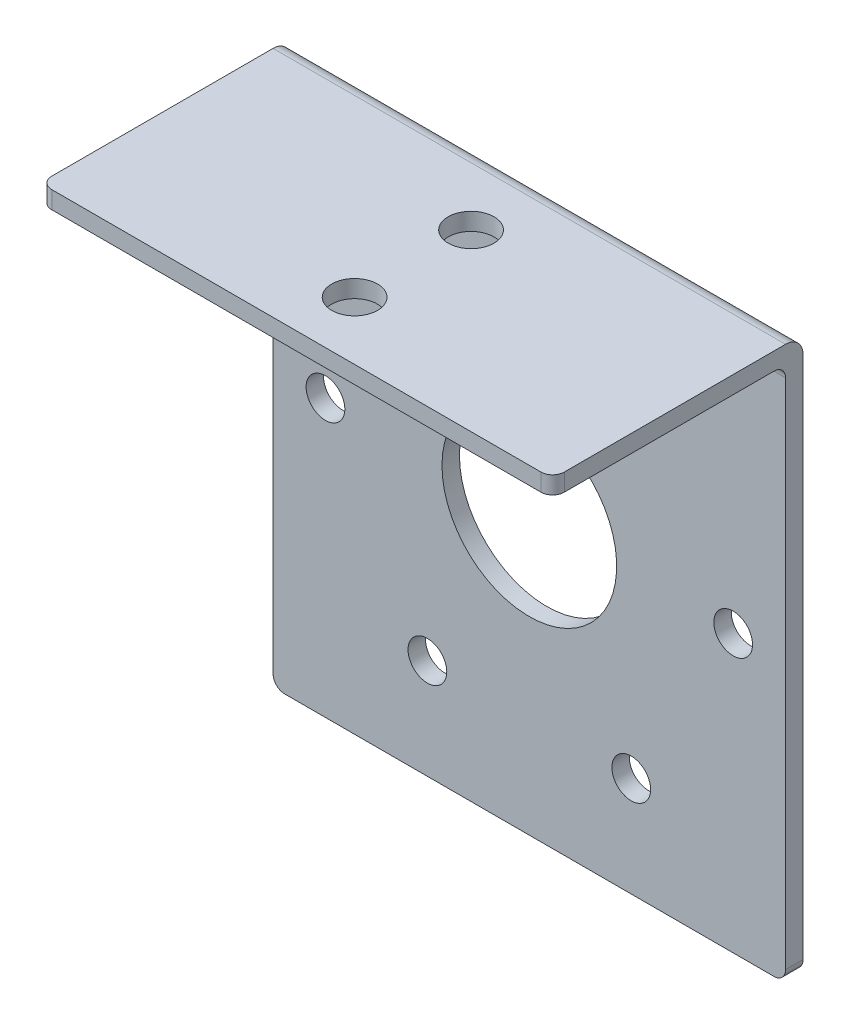
ISO-10303-21;
HEADER;
FILE_DESCRIPTION(('STEP AP214'),'2;1');
FILE_NAME('part.step','',(''),(''),'','','');
FILE_SCHEMA(('AUTOMOTIVE_DESIGN { 1 0 10303 214 1 1 1 1 }'));
ENDSEC;
DATA;
#1=APPLICATION_CONTEXT('core data for automotive mechanical design processes');
#2=APPLICATION_PROTOCOL_DEFINITION('international standard','automotive_design',2000,#1);
#3=PRODUCT_CONTEXT('',#1,'mechanical');
#4=PRODUCT('Part','Part','',(#3));
#5=PRODUCT_RELATED_PRODUCT_CATEGORY('part','',(#4));
#6=PRODUCT_DEFINITION_FORMATION('','',#4);
#7=PRODUCT_DEFINITION_CONTEXT('part definition',#1,'design');
#8=PRODUCT_DEFINITION('design','',#6,#7);
#9=PRODUCT_DEFINITION_SHAPE('','',#8);
#10=(LENGTH_UNIT() NAMED_UNIT(*) SI_UNIT(.MILLI.,.METRE.));
#11=(NAMED_UNIT(*) PLANE_ANGLE_UNIT() SI_UNIT($,.RADIAN.));
#12=(NAMED_UNIT(*) SI_UNIT($,.STERADIAN.) SOLID_ANGLE_UNIT());
#13=UNCERTAINTY_MEASURE_WITH_UNIT(LENGTH_MEASURE(1.E-05),#10,'distance_accuracy_value','');
#14=(GEOMETRIC_REPRESENTATION_CONTEXT(3) GLOBAL_UNCERTAINTY_ASSIGNED_CONTEXT((#13)) GLOBAL_UNIT_ASSIGNED_CONTEXT((#10,
#11,#12)) REPRESENTATION_CONTEXT('',''));
#15=CARTESIAN_POINT('',(0.,0.,0.));
#16=DIRECTION('',(0.,0.,1.));
#17=DIRECTION('',(1.,0.,0.));
#18=AXIS2_PLACEMENT_3D('',#15,#16,#17);
#19=CARTESIAN_POINT('',(44.,-47.5,3.));
#20=DIRECTION('',(-1.,0.,0.));
#21=DIRECTION('',(0.,0.,1.));
#22=AXIS2_PLACEMENT_3D('',#19,#20,#21);
#23=PLANE('',#22);
#24=DIRECTION('',(0.,1.,0.));
#25=VECTOR('',#24,1.);
#26=CARTESIAN_POINT('',(44.,-47.5,3.));
#27=LINE('',#26,#25);
#28=CARTESIAN_POINT('',(44.,-45.5,3.));
#29=VERTEX_POINT('',#28);
#30=CARTESIAN_POINT('',(44.,42.5,3.));
#31=VERTEX_POINT('',#30);
#32=EDGE_CURVE('E247',#29,#31,#27,.T.);
#33=ORIENTED_EDGE('',*,*,#32,.F.);
#34=DIRECTION('',(0.,0.,-1.));
#35=VECTOR('',#34,1.);
#36=CARTESIAN_POINT('',(44.,-45.5,3.));
#37=LINE('',#36,#35);
#38=CARTESIAN_POINT('',(44.,-45.5,0.));
#39=VERTEX_POINT('',#38);
#40=EDGE_CURVE('E171',#29,#39,#37,.T.);
#41=ORIENTED_EDGE('',*,*,#40,.T.);
#42=DIRECTION('',(0.,1.,0.));
#43=VECTOR('',#42,1.);
#44=CARTESIAN_POINT('',(44.,-47.5,0.));
#45=LINE('',#44,#43);
#46=CARTESIAN_POINT('',(44.,44.5,0.));
#47=VERTEX_POINT('',#46);
#48=EDGE_CURVE('E136',#39,#47,#45,.T.);
#49=ORIENTED_EDGE('',*,*,#48,.T.);
#50=CARTESIAN_POINT('',(44.,44.5,3.));
#51=DIRECTION('',(-1.,0.,0.));
#52=DIRECTION('',(0.,0.,1.));
#53=AXIS2_PLACEMENT_3D('',#50,#51,#52);
#54=CIRCLE('',#53,3.);
#55=CARTESIAN_POINT('',(44.,47.5,3.));
#56=VERTEX_POINT('',#55);
#57=EDGE_CURVE('E132',#47,#56,#54,.F.);
#58=ORIENTED_EDGE('',*,*,#57,.T.);
#59=DIRECTION('',(0.,0.,-1.));
#60=VECTOR('',#59,1.);
#61=CARTESIAN_POINT('',(44.,47.5,3.));
#62=LINE('',#61,#60);
#63=CARTESIAN_POINT('',(44.,47.5,41.));
#64=VERTEX_POINT('',#63);
#65=EDGE_CURVE('E123',#64,#56,#62,.T.);
#66=ORIENTED_EDGE('',*,*,#65,.F.);
#67=DIRECTION('',(0.,1.,0.));
#68=VECTOR('',#67,1.);
#69=CARTESIAN_POINT('',(44.,44.5,41.));
#70=LINE('',#69,#68);
#71=CARTESIAN_POINT('',(44.,44.5,41.));
#72=VERTEX_POINT('',#71);
#73=EDGE_CURVE('E160',#64,#72,#70,.F.);
#74=ORIENTED_EDGE('',*,*,#73,.T.);
#75=DIRECTION('',(0.,0.,1.));
#76=VECTOR('',#75,1.);
#77=CARTESIAN_POINT('',(44.,44.5,2.));
#78=LINE('',#77,#76);
#79=CARTESIAN_POINT('',(44.,44.5,5.));
#80=VERTEX_POINT('',#79);
#81=EDGE_CURVE('E242',#80,#72,#78,.T.);
#82=ORIENTED_EDGE('',*,*,#81,.F.);
#83=CARTESIAN_POINT('',(44.,42.5,5.));
#84=DIRECTION('',(-1.,0.,0.));
#85=DIRECTION('',(0.,0.,1.));
#86=AXIS2_PLACEMENT_3D('',#83,#84,#85);
#87=CIRCLE('',#86,2.);
#88=EDGE_CURVE('E157',#80,#31,#87,.T.);
#89=ORIENTED_EDGE('',*,*,#88,.T.);
#90=EDGE_LOOP('',(#33,#41,#49,#58,#66,#74,#82,#89));
#91=FACE_BOUND('',#90,.T.);
#92=ADVANCED_FACE('F33',(#91),#23,.F.);
#93=CARTESIAN_POINT('',(-44.,47.5,3.));
#94=DIRECTION('',(0.,-1.,0.));
#95=DIRECTION('',(0.,0.,-1.));
#96=AXIS2_PLACEMENT_3D('',#93,#94,#95);
#97=PLANE('',#96);
#98=CARTESIAN_POINT('',(0.,47.5,33.));
#99=DIRECTION('',(0.,1.,0.));
#100=DIRECTION('',(0.,0.,1.));
#101=AXIS2_PLACEMENT_3D('',#98,#99,#100);
#102=CIRCLE('',#101,3.935);
#103=CARTESIAN_POINT('',(0.,47.5,36.935));
#104=VERTEX_POINT('',#103);
#105=EDGE_CURVE('E169',#104,#104,#102,.T.);
#106=ORIENTED_EDGE('',*,*,#105,.F.);
#107=EDGE_LOOP('',(#106));
#108=FACE_BOUND('',#107,.T.);
#109=CARTESIAN_POINT('',(0.,47.5,13.));
#110=DIRECTION('',(0.,1.,0.));
#111=DIRECTION('',(0.,0.,1.));
#112=AXIS2_PLACEMENT_3D('',#109,#110,#111);
#113=CIRCLE('',#112,3.935);
#114=CARTESIAN_POINT('',(0.,47.5,16.935));
#115=VERTEX_POINT('',#114);
#116=EDGE_CURVE('E165',#115,#115,#113,.T.);
#117=ORIENTED_EDGE('',*,*,#116,.F.);
#118=EDGE_LOOP('',(#117));
#119=FACE_BOUND('',#118,.T.);
#120=DIRECTION('',(0.,0.,-1.));
#121=VECTOR('',#120,1.);
#122=CARTESIAN_POINT('',(-44.,47.5,3.));
#123=LINE('',#122,#121);
#124=CARTESIAN_POINT('',(-44.,47.5,41.));
#125=VERTEX_POINT('',#124);
#126=CARTESIAN_POINT('',(-44.,47.5,3.));
#127=VERTEX_POINT('',#126);
#128=EDGE_CURVE('E129',#125,#127,#123,.T.);
#129=ORIENTED_EDGE('',*,*,#128,.F.);
#130=CARTESIAN_POINT('',(-42.,47.5,41.));
#131=DIRECTION('',(0.,-1.,0.));
#132=DIRECTION('',(0.,0.,-1.));
#133=AXIS2_PLACEMENT_3D('',#130,#131,#132);
#134=CIRCLE('',#133,2.);
#135=CARTESIAN_POINT('',(-42.,47.5,43.));
#136=VERTEX_POINT('',#135);
#137=EDGE_CURVE('E11',#125,#136,#134,.F.);
#138=ORIENTED_EDGE('',*,*,#137,.T.);
#139=DIRECTION('',(-1.,0.,0.));
#140=VECTOR('',#139,1.);
#141=CARTESIAN_POINT('',(-44.,47.5,43.));
#142=LINE('',#141,#140);
#143=CARTESIAN_POINT('',(42.,47.5,43.));
#144=VERTEX_POINT('',#143);
#145=EDGE_CURVE('E239',#144,#136,#142,.T.);
#146=ORIENTED_EDGE('',*,*,#145,.F.);
#147=CARTESIAN_POINT('',(42.,47.5,41.));
#148=DIRECTION('',(0.,-1.,0.));
#149=DIRECTION('',(0.,0.,-1.));
#150=AXIS2_PLACEMENT_3D('',#147,#148,#149);
#151=CIRCLE('',#150,2.);
#152=EDGE_CURVE('E42',#144,#64,#151,.F.);
#153=ORIENTED_EDGE('',*,*,#152,.T.);
#154=ORIENTED_EDGE('',*,*,#65,.T.);
#155=DIRECTION('',(-1.,0.,0.));
#156=VECTOR('',#155,1.);
#157=CARTESIAN_POINT('',(-44.,47.5,3.));
#158=LINE('',#157,#156);
#159=EDGE_CURVE('E127',#56,#127,#158,.T.);
#160=ORIENTED_EDGE('',*,*,#159,.T.);
#161=EDGE_LOOP('',(#129,#138,#146,#153,#154,#160));
#162=FACE_BOUND('',#161,.T.);
#163=ADVANCED_FACE('F125',(#108,#119,#162),#97,.F.);
#164=CARTESIAN_POINT('',(-44.,-47.5,3.));
#165=DIRECTION('',(1.,0.,0.));
#166=DIRECTION('',(0.,0.,-1.));
#167=AXIS2_PLACEMENT_3D('',#164,#165,#166);
#168=PLANE('',#167);
#169=DIRECTION('',(0.,-1.,0.));
#170=VECTOR('',#169,1.);
#171=CARTESIAN_POINT('',(-44.,-47.5,0.));
#172=LINE('',#171,#170);
#173=CARTESIAN_POINT('',(-44.,44.5,0.));
#174=VERTEX_POINT('',#173);
#175=CARTESIAN_POINT('',(-44.,-45.5,0.));
#176=VERTEX_POINT('',#175);
#177=EDGE_CURVE('E257',#174,#176,#172,.T.);
#178=ORIENTED_EDGE('',*,*,#177,.T.);
#179=DIRECTION('',(0.,0.,-1.));
#180=VECTOR('',#179,1.);
#181=CARTESIAN_POINT('',(-44.,-45.5,3.));
#182=LINE('',#181,#180);
#183=CARTESIAN_POINT('',(-44.,-45.5,3.));
#184=VERTEX_POINT('',#183);
#185=EDGE_CURVE('E188',#176,#184,#182,.F.);
#186=ORIENTED_EDGE('',*,*,#185,.T.);
#187=DIRECTION('',(0.,-1.,0.));
#188=VECTOR('',#187,1.);
#189=CARTESIAN_POINT('',(-44.,-47.5,3.));
#190=LINE('',#189,#188);
#191=CARTESIAN_POINT('',(-44.,42.5,3.));
#192=VERTEX_POINT('',#191);
#193=EDGE_CURVE('E249',#192,#184,#190,.T.);
#194=ORIENTED_EDGE('',*,*,#193,.F.);
#195=CARTESIAN_POINT('',(-44.,42.5,5.));
#196=DIRECTION('',(1.,0.,0.));
#197=DIRECTION('',(0.,0.,-1.));
#198=AXIS2_PLACEMENT_3D('',#195,#196,#197);
#199=CIRCLE('',#198,2.);
#200=CARTESIAN_POINT('',(-44.,44.5,5.));
#201=VERTEX_POINT('',#200);
#202=EDGE_CURVE('E155',#192,#201,#199,.T.);
#203=ORIENTED_EDGE('',*,*,#202,.T.);
#204=DIRECTION('',(0.,0.,1.));
#205=VECTOR('',#204,1.);
#206=CARTESIAN_POINT('',(-44.,44.5,2.));
#207=LINE('',#206,#205);
#208=CARTESIAN_POINT('',(-44.,44.5,41.));
#209=VERTEX_POINT('',#208);
#210=EDGE_CURVE('E241',#201,#209,#207,.T.);
#211=ORIENTED_EDGE('',*,*,#210,.T.);
#212=DIRECTION('',(0.,-1.,0.));
#213=VECTOR('',#212,1.);
#214=CARTESIAN_POINT('',(-44.,47.5,41.));
#215=LINE('',#214,#213);
#216=EDGE_CURVE('E186',#209,#125,#215,.F.);
#217=ORIENTED_EDGE('',*,*,#216,.T.);
#218=ORIENTED_EDGE('',*,*,#128,.T.);
#219=CARTESIAN_POINT('',(-44.,44.5,3.));
#220=DIRECTION('',(1.,0.,0.));
#221=DIRECTION('',(0.,0.,-1.));
#222=AXIS2_PLACEMENT_3D('',#219,#220,#221);
#223=CIRCLE('',#222,3.);
#224=EDGE_CURVE('E145',#127,#174,#223,.F.);
#225=ORIENTED_EDGE('',*,*,#224,.T.);
#226=EDGE_LOOP('',(#178,#186,#194,#203,#211,#217,#218,#225));
#227=FACE_BOUND('',#226,.T.);
#228=ADVANCED_FACE('F262',(#227),#168,.F.);
#229=CARTESIAN_POINT('',(-44.,-47.5,3.));
#230=DIRECTION('',(0.,1.,0.));
#231=DIRECTION('',(0.,0.,1.));
#232=AXIS2_PLACEMENT_3D('',#229,#230,#231);
#233=PLANE('',#232);
#234=DIRECTION('',(1.,0.,0.));
#235=VECTOR('',#234,1.);
#236=CARTESIAN_POINT('',(-44.,-47.5,0.));
#237=LINE('',#236,#235);
#238=CARTESIAN_POINT('',(-42.,-47.5,0.));
#239=VERTEX_POINT('',#238);
#240=CARTESIAN_POINT('',(42.,-47.5,0.));
#241=VERTEX_POINT('',#240);
#242=EDGE_CURVE('E250',#239,#241,#237,.T.);
#243=ORIENTED_EDGE('',*,*,#242,.T.);
#244=DIRECTION('',(0.,0.,-1.));
#245=VECTOR('',#244,1.);
#246=CARTESIAN_POINT('',(42.,-47.5,3.));
#247=LINE('',#246,#245);
#248=CARTESIAN_POINT('',(42.,-47.5,3.));
#249=VERTEX_POINT('',#248);
#250=EDGE_CURVE('E180',#241,#249,#247,.F.);
#251=ORIENTED_EDGE('',*,*,#250,.T.);
#252=DIRECTION('',(1.,0.,0.));
#253=VECTOR('',#252,1.);
#254=CARTESIAN_POINT('',(-44.,-47.5,3.));
#255=LINE('',#254,#253);
#256=CARTESIAN_POINT('',(-42.,-47.5,3.));
#257=VERTEX_POINT('',#256);
#258=EDGE_CURVE('E253',#257,#249,#255,.T.);
#259=ORIENTED_EDGE('',*,*,#258,.F.);
#260=DIRECTION('',(0.,0.,-1.));
#261=VECTOR('',#260,1.);
#262=CARTESIAN_POINT('',(-42.,-47.5,3.));
#263=LINE('',#262,#261);
#264=EDGE_CURVE('E177',#257,#239,#263,.T.);
#265=ORIENTED_EDGE('',*,*,#264,.T.);
#266=EDGE_LOOP('',(#243,#251,#259,#265));
#267=FACE_BOUND('',#266,.T.);
#268=ADVANCED_FACE('F292',(#267),#233,.F.);
#269=CARTESIAN_POINT('',(0.,0.,3.));
#270=DIRECTION('',(0.,0.,-1.));
#271=DIRECTION('',(-1.,0.,0.));
#272=AXIS2_PLACEMENT_3D('',#269,#270,#271);
#273=PLANE('',#272);
#274=CARTESIAN_POINT('',(17.5000000000004,30.3108891324552,3.));
#275=DIRECTION('',(0.,0.,1.));
#276=DIRECTION('',(0.50000000000001,0.866025403784433,0.));
#277=AXIS2_PLACEMENT_3D('',#274,#275,#276);
#278=CIRCLE('',#277,3.325);
#279=CARTESIAN_POINT('',(19.1625000000004,33.1904236000384,3.));
#280=VERTEX_POINT('',#279);
#281=EDGE_CURVE('E467',#280,#280,#278,.T.);
#282=ORIENTED_EDGE('',*,*,#281,.F.);
#283=EDGE_LOOP('',(#282));
#284=FACE_BOUND('',#283,.T.);
#285=CARTESIAN_POINT('',(-17.4999999999997,30.3108891324555,3.));
#286=DIRECTION('',(0.,0.,1.));
#287=DIRECTION('',(-0.499999999999992,0.866025403784443,0.));
#288=AXIS2_PLACEMENT_3D('',#285,#286,#287);
#289=CIRCLE('',#288,3.325);
#290=CARTESIAN_POINT('',(-19.1624999999997,33.1904236000388,3.));
#291=VERTEX_POINT('',#290);
#292=EDGE_CURVE('E468',#291,#291,#289,.T.);
#293=ORIENTED_EDGE('',*,*,#292,.F.);
#294=EDGE_LOOP('',(#293));
#295=FACE_BOUND('',#294,.T.);
#296=CARTESIAN_POINT('',(-35.,0.,3.));
#297=DIRECTION('',(0.,0.,1.));
#298=DIRECTION('',(-1.,0.,0.));
#299=AXIS2_PLACEMENT_3D('',#296,#297,#298);
#300=CIRCLE('',#299,3.325);
#301=CARTESIAN_POINT('',(-38.325,0.,3.));
#302=VERTEX_POINT('',#301);
#303=EDGE_CURVE('E470',#302,#302,#300,.T.);
#304=ORIENTED_EDGE('',*,*,#303,.F.);
#305=EDGE_LOOP('',(#304));
#306=FACE_BOUND('',#305,.T.);
#307=CARTESIAN_POINT('',(-17.5000000000001,-30.3108891324553,3.));
#308=DIRECTION('',(0.,0.,1.));
#309=DIRECTION('',(-0.500000000000004,-0.866025403784436,0.));
#310=AXIS2_PLACEMENT_3D('',#307,#308,#309);
#311=CIRCLE('',#310,3.325);
#312=CARTESIAN_POINT('',(-19.1625000000002,-33.1904236000385,3.));
#313=VERTEX_POINT('',#312);
#314=EDGE_CURVE('E475',#313,#313,#311,.T.);
#315=ORIENTED_EDGE('',*,*,#314,.F.);
#316=EDGE_LOOP('',(#315));
#317=FACE_BOUND('',#316,.T.);
#318=CARTESIAN_POINT('',(17.4999999999999,-30.3108891324554,3.));
#319=DIRECTION('',(0.,0.,1.));
#320=DIRECTION('',(0.499999999999998,-0.86602540378444,0.));
#321=AXIS2_PLACEMENT_3D('',#318,#319,#320);
#322=CIRCLE('',#321,3.325);
#323=CARTESIAN_POINT('',(19.1624999999999,-33.1904236000387,3.));
#324=VERTEX_POINT('',#323);
#325=EDGE_CURVE('E208',#324,#324,#322,.T.);
#326=ORIENTED_EDGE('',*,*,#325,.F.);
#327=EDGE_LOOP('',(#326));
#328=FACE_BOUND('',#327,.T.);
#329=CARTESIAN_POINT('',(35.,0.,3.));
#330=DIRECTION('',(0.,0.,1.));
#331=DIRECTION('',(1.,0.,0.));
#332=AXIS2_PLACEMENT_3D('',#329,#330,#331);
#333=CIRCLE('',#332,3.325);
#334=CARTESIAN_POINT('',(38.325,0.,3.));
#335=VERTEX_POINT('',#334);
#336=EDGE_CURVE('E203',#335,#335,#333,.T.);
#337=ORIENTED_EDGE('',*,*,#336,.F.);
#338=EDGE_LOOP('',(#337));
#339=FACE_BOUND('',#338,.T.);
#340=CARTESIAN_POINT('',(0.,0.,3.));
#341=DIRECTION('',(0.,0.,-1.));
#342=DIRECTION('',(-1.,0.,0.));
#343=AXIS2_PLACEMENT_3D('',#340,#341,#342);
#344=CIRCLE('',#343,15.);
#345=CARTESIAN_POINT('',(-15.,0.,3.));
#346=VERTEX_POINT('',#345);
#347=EDGE_CURVE('E233',#346,#346,#344,.T.);
#348=ORIENTED_EDGE('',*,*,#347,.T.);
#349=EDGE_LOOP('',(#348));
#350=FACE_BOUND('',#349,.T.);
#351=ORIENTED_EDGE('',*,*,#258,.T.);
#352=CARTESIAN_POINT('',(42.,-45.5,3.));
#353=DIRECTION('',(0.,0.,-1.));
#354=DIRECTION('',(-1.,0.,0.));
#355=AXIS2_PLACEMENT_3D('',#352,#353,#354);
#356=CIRCLE('',#355,2.);
#357=EDGE_CURVE('E184',#249,#29,#356,.F.);
#358=ORIENTED_EDGE('',*,*,#357,.T.);
#359=ORIENTED_EDGE('',*,*,#32,.T.);
#360=DIRECTION('',(-1.,0.,0.));
#361=VECTOR('',#360,1.);
#362=CARTESIAN_POINT('',(0.,42.5,3.));
#363=LINE('',#362,#361);
#364=EDGE_CURVE('E140',#31,#192,#363,.T.);
#365=ORIENTED_EDGE('',*,*,#364,.T.);
#366=ORIENTED_EDGE('',*,*,#193,.T.);
#367=CARTESIAN_POINT('',(-42.,-45.5,3.));
#368=DIRECTION('',(0.,0.,-1.));
#369=DIRECTION('',(-1.,0.,0.));
#370=AXIS2_PLACEMENT_3D('',#367,#368,#369);
#371=CIRCLE('',#370,2.);
#372=EDGE_CURVE('E182',#184,#257,#371,.F.);
#373=ORIENTED_EDGE('',*,*,#372,.T.);
#374=EDGE_LOOP('',(#351,#358,#359,#365,#366,#373));
#375=FACE_BOUND('',#374,.T.);
#376=ADVANCED_FACE('F283',(#284,#295,#306,#317,#328,#339,#350,#375),#273,.F.);
#377=CARTESIAN_POINT('',(0.,0.,0.));
#378=DIRECTION('',(0.,0.,-1.));
#379=DIRECTION('',(-1.,0.,0.));
#380=AXIS2_PLACEMENT_3D('',#377,#378,#379);
#381=PLANE('',#380);
#382=CARTESIAN_POINT('',(17.5000000000004,30.3108891324552,0.));
#383=DIRECTION('',(0.,0.,-1.));
#384=DIRECTION('',(-1.,0.,0.));
#385=AXIS2_PLACEMENT_3D('',#382,#383,#384);
#386=CIRCLE('',#385,3.325);
#387=CARTESIAN_POINT('',(14.1750000000004,30.3108891324552,0.));
#388=VERTEX_POINT('',#387);
#389=EDGE_CURVE('E37',#388,#388,#386,.T.);
#390=ORIENTED_EDGE('',*,*,#389,.F.);
#391=EDGE_LOOP('',(#390));
#392=FACE_BOUND('',#391,.T.);
#393=CARTESIAN_POINT('',(-17.4999999999997,30.3108891324555,0.));
#394=DIRECTION('',(0.,0.,-1.));
#395=DIRECTION('',(-1.,0.,0.));
#396=AXIS2_PLACEMENT_3D('',#393,#394,#395);
#397=CIRCLE('',#396,3.325);
#398=CARTESIAN_POINT('',(-20.8249999999997,30.3108891324555,0.));
#399=VERTEX_POINT('',#398);
#400=EDGE_CURVE('E213',#399,#399,#397,.T.);
#401=ORIENTED_EDGE('',*,*,#400,.F.);
#402=EDGE_LOOP('',(#401));
#403=FACE_BOUND('',#402,.T.);
#404=CARTESIAN_POINT('',(-35.,0.,0.));
#405=DIRECTION('',(0.,0.,-1.));
#406=DIRECTION('',(-1.,0.,0.));
#407=AXIS2_PLACEMENT_3D('',#404,#405,#406);
#408=CIRCLE('',#407,3.325);
#409=CARTESIAN_POINT('',(-38.325,0.,0.));
#410=VERTEX_POINT('',#409);
#411=EDGE_CURVE('E211',#410,#410,#408,.T.);
#412=ORIENTED_EDGE('',*,*,#411,.F.);
#413=EDGE_LOOP('',(#412));
#414=FACE_BOUND('',#413,.T.);
#415=CARTESIAN_POINT('',(-17.5000000000001,-30.3108891324553,0.));
#416=DIRECTION('',(0.,0.,-1.));
#417=DIRECTION('',(-1.,0.,0.));
#418=AXIS2_PLACEMENT_3D('',#415,#416,#417);
#419=CIRCLE('',#418,3.325);
#420=CARTESIAN_POINT('',(-20.8250000000001,-30.3108891324553,0.));
#421=VERTEX_POINT('',#420);
#422=EDGE_CURVE('E207',#421,#421,#419,.T.);
#423=ORIENTED_EDGE('',*,*,#422,.F.);
#424=EDGE_LOOP('',(#423));
#425=FACE_BOUND('',#424,.T.);
#426=CARTESIAN_POINT('',(17.4999999999999,-30.3108891324554,0.));
#427=DIRECTION('',(0.,0.,-1.));
#428=DIRECTION('',(-1.,0.,0.));
#429=AXIS2_PLACEMENT_3D('',#426,#427,#428);
#430=CIRCLE('',#429,3.325);
#431=CARTESIAN_POINT('',(14.1749999999999,-30.3108891324554,0.));
#432=VERTEX_POINT('',#431);
#433=EDGE_CURVE('E204',#432,#432,#430,.T.);
#434=ORIENTED_EDGE('',*,*,#433,.F.);
#435=EDGE_LOOP('',(#434));
#436=FACE_BOUND('',#435,.T.);
#437=CARTESIAN_POINT('',(35.,0.,0.));
#438=DIRECTION('',(0.,0.,-1.));
#439=DIRECTION('',(-1.,0.,0.));
#440=AXIS2_PLACEMENT_3D('',#437,#438,#439);
#441=CIRCLE('',#440,3.325);
#442=CARTESIAN_POINT('',(31.675,0.,0.));
#443=VERTEX_POINT('',#442);
#444=EDGE_CURVE('E200',#443,#443,#441,.T.);
#445=ORIENTED_EDGE('',*,*,#444,.F.);
#446=EDGE_LOOP('',(#445));
#447=FACE_BOUND('',#446,.T.);
#448=CARTESIAN_POINT('',(0.,0.,0.));
#449=DIRECTION('',(0.,0.,-1.));
#450=DIRECTION('',(-1.,0.,0.));
#451=AXIS2_PLACEMENT_3D('',#448,#449,#450);
#452=CIRCLE('',#451,15.);
#453=CARTESIAN_POINT('',(-15.,0.,0.));
#454=VERTEX_POINT('',#453);
#455=EDGE_CURVE('E164',#454,#454,#452,.T.);
#456=ORIENTED_EDGE('',*,*,#455,.F.);
#457=EDGE_LOOP('',(#456));
#458=FACE_BOUND('',#457,.T.);
#459=ORIENTED_EDGE('',*,*,#48,.F.);
#460=CARTESIAN_POINT('',(42.,-45.5,0.));
#461=DIRECTION('',(0.,0.,-1.));
#462=DIRECTION('',(-1.,0.,0.));
#463=AXIS2_PLACEMENT_3D('',#460,#461,#462);
#464=CIRCLE('',#463,2.);
#465=EDGE_CURVE('E175',#39,#241,#464,.T.);
#466=ORIENTED_EDGE('',*,*,#465,.T.);
#467=ORIENTED_EDGE('',*,*,#242,.F.);
#468=CARTESIAN_POINT('',(-42.,-45.5,0.));
#469=DIRECTION('',(0.,0.,-1.));
#470=DIRECTION('',(-1.,0.,0.));
#471=AXIS2_PLACEMENT_3D('',#468,#469,#470);
#472=CIRCLE('',#471,2.);
#473=EDGE_CURVE('E173',#239,#176,#472,.T.);
#474=ORIENTED_EDGE('',*,*,#473,.T.);
#475=ORIENTED_EDGE('',*,*,#177,.F.);
#476=DIRECTION('',(-1.,0.,0.));
#477=VECTOR('',#476,1.);
#478=CARTESIAN_POINT('',(44.,44.5,0.));
#479=LINE('',#478,#477);
#480=EDGE_CURVE('E141',#174,#47,#479,.F.);
#481=ORIENTED_EDGE('',*,*,#480,.T.);
#482=EDGE_LOOP('',(#459,#466,#467,#474,#475,#481));
#483=FACE_BOUND('',#482,.T.);
#484=ADVANCED_FACE('F299',(#392,#403,#414,#425,#436,#447,#458,#483),#381,.T.);
#485=CARTESIAN_POINT('',(-44.,44.5,2.));
#486=DIRECTION('',(0.,-1.,0.));
#487=DIRECTION('',(0.,0.,-1.));
#488=AXIS2_PLACEMENT_3D('',#485,#486,#487);
#489=PLANE('',#488);
#490=CARTESIAN_POINT('',(0.,44.5,33.));
#491=DIRECTION('',(0.,-1.,0.));
#492=DIRECTION('',(0.,0.,-1.));
#493=AXIS2_PLACEMENT_3D('',#490,#491,#492);
#494=CIRCLE('',#493,3.935);
#495=CARTESIAN_POINT('',(0.,44.5,29.065));
#496=VERTEX_POINT('',#495);
#497=EDGE_CURVE('E166',#496,#496,#494,.T.);
#498=ORIENTED_EDGE('',*,*,#497,.F.);
#499=EDGE_LOOP('',(#498));
#500=FACE_BOUND('',#499,.T.);
#501=CARTESIAN_POINT('',(0.,44.5,13.));
#502=DIRECTION('',(0.,-1.,0.));
#503=DIRECTION('',(0.,0.,-1.));
#504=AXIS2_PLACEMENT_3D('',#501,#502,#503);
#505=CIRCLE('',#504,3.935);
#506=CARTESIAN_POINT('',(0.,44.5,9.065));
#507=VERTEX_POINT('',#506);
#508=EDGE_CURVE('E161',#507,#507,#505,.T.);
#509=ORIENTED_EDGE('',*,*,#508,.F.);
#510=EDGE_LOOP('',(#509));
#511=FACE_BOUND('',#510,.T.);
#512=DIRECTION('',(1.,0.,0.));
#513=VECTOR('',#512,1.);
#514=CARTESIAN_POINT('',(-44.,44.5,43.));
#515=LINE('',#514,#513);
#516=CARTESIAN_POINT('',(-42.,44.5,43.));
#517=VERTEX_POINT('',#516);
#518=CARTESIAN_POINT('',(42.,44.5,43.));
#519=VERTEX_POINT('',#518);
#520=EDGE_CURVE('E236',#517,#519,#515,.T.);
#521=ORIENTED_EDGE('',*,*,#520,.F.);
#522=CARTESIAN_POINT('',(-42.,44.5,41.));
#523=DIRECTION('',(0.,-1.,0.));
#524=DIRECTION('',(0.,0.,-1.));
#525=AXIS2_PLACEMENT_3D('',#522,#523,#524);
#526=CIRCLE('',#525,2.);
#527=EDGE_CURVE('E197',#517,#209,#526,.T.);
#528=ORIENTED_EDGE('',*,*,#527,.T.);
#529=ORIENTED_EDGE('',*,*,#210,.F.);
#530=DIRECTION('',(-1.,0.,0.));
#531=VECTOR('',#530,1.);
#532=CARTESIAN_POINT('',(-44.,44.5,5.));
#533=LINE('',#532,#531);
#534=EDGE_CURVE('E153',#201,#80,#533,.F.);
#535=ORIENTED_EDGE('',*,*,#534,.T.);
#536=ORIENTED_EDGE('',*,*,#81,.T.);
#537=CARTESIAN_POINT('',(42.,44.5,41.));
#538=DIRECTION('',(0.,-1.,0.));
#539=DIRECTION('',(0.,0.,-1.));
#540=AXIS2_PLACEMENT_3D('',#537,#538,#539);
#541=CIRCLE('',#540,2.);
#542=EDGE_CURVE('E195',#72,#519,#541,.T.);
#543=ORIENTED_EDGE('',*,*,#542,.T.);
#544=EDGE_LOOP('',(#521,#528,#529,#535,#536,#543));
#545=FACE_BOUND('',#544,.T.);
#546=ADVANCED_FACE('F272',(#500,#511,#545),#489,.T.);
#547=CARTESIAN_POINT('',(0.,0.,43.));
#548=DIRECTION('',(0.,0.,1.));
#549=DIRECTION('',(1.,0.,0.));
#550=AXIS2_PLACEMENT_3D('',#547,#548,#549);
#551=PLANE('',#550);
#552=ORIENTED_EDGE('',*,*,#145,.T.);
#553=DIRECTION('',(0.,-1.,0.));
#554=VECTOR('',#553,1.);
#555=CARTESIAN_POINT('',(-42.,44.5,43.));
#556=LINE('',#555,#554);
#557=EDGE_CURVE('E192',#136,#517,#556,.T.);
#558=ORIENTED_EDGE('',*,*,#557,.T.);
#559=ORIENTED_EDGE('',*,*,#520,.T.);
#560=DIRECTION('',(0.,1.,0.));
#561=VECTOR('',#560,1.);
#562=CARTESIAN_POINT('',(42.,47.5,43.));
#563=LINE('',#562,#561);
#564=EDGE_CURVE('E190',#519,#144,#563,.T.);
#565=ORIENTED_EDGE('',*,*,#564,.T.);
#566=EDGE_LOOP('',(#552,#558,#559,#565));
#567=FACE_BOUND('',#566,.T.);
#568=ADVANCED_FACE('F270',(#567),#551,.T.);
#569=CARTESIAN_POINT('',(0.,0.,10.));
#570=DIRECTION('',(0.,0.,-1.));
#571=DIRECTION('',(-1.,0.,0.));
#572=AXIS2_PLACEMENT_3D('',#569,#570,#571);
#573=CYLINDRICAL_SURFACE('',#572,15.);
#574=ORIENTED_EDGE('',*,*,#455,.T.);
#575=EDGE_LOOP('',(#574));
#576=FACE_BOUND('',#575,.T.);
#577=ORIENTED_EDGE('',*,*,#347,.F.);
#578=EDGE_LOOP('',(#577));
#579=FACE_BOUND('',#578,.T.);
#580=ADVANCED_FACE('F324',(#576,#579),#573,.F.);
#581=CARTESIAN_POINT('',(-44.,44.5,3.));
#582=DIRECTION('',(1.,0.,0.));
#583=DIRECTION('',(0.,0.,-1.));
#584=AXIS2_PLACEMENT_3D('',#581,#582,#583);
#585=CYLINDRICAL_SURFACE('',#584,3.);
#586=ORIENTED_EDGE('',*,*,#57,.F.);
#587=ORIENTED_EDGE('',*,*,#480,.F.);
#588=ORIENTED_EDGE('',*,*,#224,.F.);
#589=ORIENTED_EDGE('',*,*,#159,.F.);
#590=EDGE_LOOP('',(#586,#587,#588,#589));
#591=FACE_BOUND('',#590,.T.);
#592=ADVANCED_FACE('F144',(#591),#585,.T.);
#593=CARTESIAN_POINT('',(0.,42.5,5.));
#594=DIRECTION('',(-1.,0.,0.));
#595=DIRECTION('',(0.,0.,1.));
#596=AXIS2_PLACEMENT_3D('',#593,#594,#595);
#597=CYLINDRICAL_SURFACE('',#596,2.);
#598=ORIENTED_EDGE('',*,*,#88,.F.);
#599=ORIENTED_EDGE('',*,*,#534,.F.);
#600=ORIENTED_EDGE('',*,*,#202,.F.);
#601=ORIENTED_EDGE('',*,*,#364,.F.);
#602=EDGE_LOOP('',(#598,#599,#600,#601));
#603=FACE_BOUND('',#602,.T.);
#604=ADVANCED_FACE('F280',(#603),#597,.F.);
#605=CARTESIAN_POINT('',(0.,37.5,13.));
#606=DIRECTION('',(0.,1.,0.));
#607=DIRECTION('',(0.,0.,1.));
#608=AXIS2_PLACEMENT_3D('',#605,#606,#607);
#609=CYLINDRICAL_SURFACE('',#608,3.935);
#610=ORIENTED_EDGE('',*,*,#508,.T.);
#611=EDGE_LOOP('',(#610));
#612=FACE_BOUND('',#611,.T.);
#613=ORIENTED_EDGE('',*,*,#116,.T.);
#614=EDGE_LOOP('',(#613));
#615=FACE_BOUND('',#614,.T.);
#616=ADVANCED_FACE('F327',(#612,#615),#609,.F.);
#617=CARTESIAN_POINT('',(0.,37.5,33.));
#618=DIRECTION('',(0.,1.,0.));
#619=DIRECTION('',(0.,0.,1.));
#620=AXIS2_PLACEMENT_3D('',#617,#618,#619);
#621=CYLINDRICAL_SURFACE('',#620,3.935);
#622=ORIENTED_EDGE('',*,*,#497,.T.);
#623=EDGE_LOOP('',(#622));
#624=FACE_BOUND('',#623,.T.);
#625=ORIENTED_EDGE('',*,*,#105,.T.);
#626=EDGE_LOOP('',(#625));
#627=FACE_BOUND('',#626,.T.);
#628=ADVANCED_FACE('F330',(#624,#627),#621,.F.);
#629=CARTESIAN_POINT('',(42.,-45.5,3.));
#630=DIRECTION('',(0.,0.,-1.));
#631=DIRECTION('',(-1.,0.,0.));
#632=AXIS2_PLACEMENT_3D('',#629,#630,#631);
#633=CYLINDRICAL_SURFACE('',#632,2.);
#634=ORIENTED_EDGE('',*,*,#357,.F.);
#635=ORIENTED_EDGE('',*,*,#250,.F.);
#636=ORIENTED_EDGE('',*,*,#465,.F.);
#637=ORIENTED_EDGE('',*,*,#40,.F.);
#638=EDGE_LOOP('',(#634,#635,#636,#637));
#639=FACE_BOUND('',#638,.T.);
#640=ADVANCED_FACE('F296',(#639),#633,.T.);
#641=CARTESIAN_POINT('',(-42.,-45.5,3.));
#642=DIRECTION('',(0.,0.,-1.));
#643=DIRECTION('',(-1.,0.,0.));
#644=AXIS2_PLACEMENT_3D('',#641,#642,#643);
#645=CYLINDRICAL_SURFACE('',#644,2.);
#646=ORIENTED_EDGE('',*,*,#372,.F.);
#647=ORIENTED_EDGE('',*,*,#185,.F.);
#648=ORIENTED_EDGE('',*,*,#473,.F.);
#649=ORIENTED_EDGE('',*,*,#264,.F.);
#650=EDGE_LOOP('',(#646,#647,#648,#649));
#651=FACE_BOUND('',#650,.T.);
#652=ADVANCED_FACE('F287',(#651),#645,.T.);
#653=CARTESIAN_POINT('',(-42.,0.,41.));
#654=DIRECTION('',(0.,1.,0.));
#655=DIRECTION('',(0.,0.,1.));
#656=AXIS2_PLACEMENT_3D('',#653,#654,#655);
#657=CYLINDRICAL_SURFACE('',#656,2.);
#658=ORIENTED_EDGE('',*,*,#137,.F.);
#659=ORIENTED_EDGE('',*,*,#216,.F.);
#660=ORIENTED_EDGE('',*,*,#527,.F.);
#661=ORIENTED_EDGE('',*,*,#557,.F.);
#662=EDGE_LOOP('',(#658,#659,#660,#661));
#663=FACE_BOUND('',#662,.T.);
#664=ADVANCED_FACE('F267',(#663),#657,.T.);
#665=CARTESIAN_POINT('',(42.,0.,41.));
#666=DIRECTION('',(0.,-1.,0.));
#667=DIRECTION('',(0.,0.,-1.));
#668=AXIS2_PLACEMENT_3D('',#665,#666,#667);
#669=CYLINDRICAL_SURFACE('',#668,2.);
#670=ORIENTED_EDGE('',*,*,#542,.F.);
#671=ORIENTED_EDGE('',*,*,#73,.F.);
#672=ORIENTED_EDGE('',*,*,#152,.F.);
#673=ORIENTED_EDGE('',*,*,#564,.F.);
#674=EDGE_LOOP('',(#670,#671,#672,#673));
#675=FACE_BOUND('',#674,.T.);
#676=ADVANCED_FACE('F35',(#675),#669,.T.);
#677=CARTESIAN_POINT('',(35.,0.,-7.));
#678=DIRECTION('',(0.,0.,1.));
#679=DIRECTION('',(1.,0.,0.));
#680=AXIS2_PLACEMENT_3D('',#677,#678,#679);
#681=CYLINDRICAL_SURFACE('',#680,3.325);
#682=ORIENTED_EDGE('',*,*,#444,.T.);
#683=EDGE_LOOP('',(#682));
#684=FACE_BOUND('',#683,.T.);
#685=ORIENTED_EDGE('',*,*,#336,.T.);
#686=EDGE_LOOP('',(#685));
#687=FACE_BOUND('',#686,.T.);
#688=ADVANCED_FACE('F336',(#684,#687),#681,.F.);
#689=CARTESIAN_POINT('',(17.4999999999999,-30.3108891324554,-7.));
#690=DIRECTION('',(0.,0.,1.));
#691=DIRECTION('',(1.,0.,0.));
#692=AXIS2_PLACEMENT_3D('',#689,#690,#691);
#693=CYLINDRICAL_SURFACE('',#692,3.325);
#694=ORIENTED_EDGE('',*,*,#433,.T.);
#695=EDGE_LOOP('',(#694));
#696=FACE_BOUND('',#695,.T.);
#697=ORIENTED_EDGE('',*,*,#325,.T.);
#698=EDGE_LOOP('',(#697));
#699=FACE_BOUND('',#698,.T.);
#700=ADVANCED_FACE('F340',(#696,#699),#693,.F.);
#701=CARTESIAN_POINT('',(-17.5000000000001,-30.3108891324553,-7.));
#702=DIRECTION('',(0.,0.,1.));
#703=DIRECTION('',(1.,0.,0.));
#704=AXIS2_PLACEMENT_3D('',#701,#702,#703);
#705=CYLINDRICAL_SURFACE('',#704,3.325);
#706=ORIENTED_EDGE('',*,*,#422,.T.);
#707=EDGE_LOOP('',(#706));
#708=FACE_BOUND('',#707,.T.);
#709=ORIENTED_EDGE('',*,*,#314,.T.);
#710=EDGE_LOOP('',(#709));
#711=FACE_BOUND('',#710,.T.);
#712=ADVANCED_FACE('F346',(#708,#711),#705,.F.);
#713=CARTESIAN_POINT('',(-35.,0.,-7.));
#714=DIRECTION('',(0.,0.,1.));
#715=DIRECTION('',(1.,0.,0.));
#716=AXIS2_PLACEMENT_3D('',#713,#714,#715);
#717=CYLINDRICAL_SURFACE('',#716,3.325);
#718=ORIENTED_EDGE('',*,*,#411,.T.);
#719=EDGE_LOOP('',(#718));
#720=FACE_BOUND('',#719,.T.);
#721=ORIENTED_EDGE('',*,*,#303,.T.);
#722=EDGE_LOOP('',(#721));
#723=FACE_BOUND('',#722,.T.);
#724=ADVANCED_FACE('F433',(#720,#723),#717,.F.);
#725=CARTESIAN_POINT('',(-17.4999999999997,30.3108891324555,-7.));
#726=DIRECTION('',(0.,0.,1.));
#727=DIRECTION('',(1.,0.,0.));
#728=AXIS2_PLACEMENT_3D('',#725,#726,#727);
#729=CYLINDRICAL_SURFACE('',#728,3.325);
#730=ORIENTED_EDGE('',*,*,#400,.T.);
#731=EDGE_LOOP('',(#730));
#732=FACE_BOUND('',#731,.T.);
#733=ORIENTED_EDGE('',*,*,#292,.T.);
#734=EDGE_LOOP('',(#733));
#735=FACE_BOUND('',#734,.T.);
#736=ADVANCED_FACE('F443',(#732,#735),#729,.F.);
#737=CARTESIAN_POINT('',(17.5000000000004,30.3108891324552,-7.));
#738=DIRECTION('',(0.,0.,1.));
#739=DIRECTION('',(1.,0.,0.));
#740=AXIS2_PLACEMENT_3D('',#737,#738,#739);
#741=CYLINDRICAL_SURFACE('',#740,3.325);
#742=ORIENTED_EDGE('',*,*,#389,.T.);
#743=EDGE_LOOP('',(#742));
#744=FACE_BOUND('',#743,.T.);
#745=ORIENTED_EDGE('',*,*,#281,.T.);
#746=EDGE_LOOP('',(#745));
#747=FACE_BOUND('',#746,.T.);
#748=ADVANCED_FACE('F453',(#744,#747),#741,.F.);
#749=CLOSED_SHELL('',(#92,#163,#228,#268,#376,#484,#546,#568,#580,#592,#604,#616,#628,#640,#652,
#664,#676,#688,#700,#712,#724,#736,#748));
#750=MANIFOLD_SOLID_BREP('B2',#749);
#751=ADVANCED_BREP_SHAPE_REPRESENTATION('',(#18,#750),#14);
#752=SHAPE_DEFINITION_REPRESENTATION(#9,#751);
ENDSEC;
END-ISO-10303-21;
